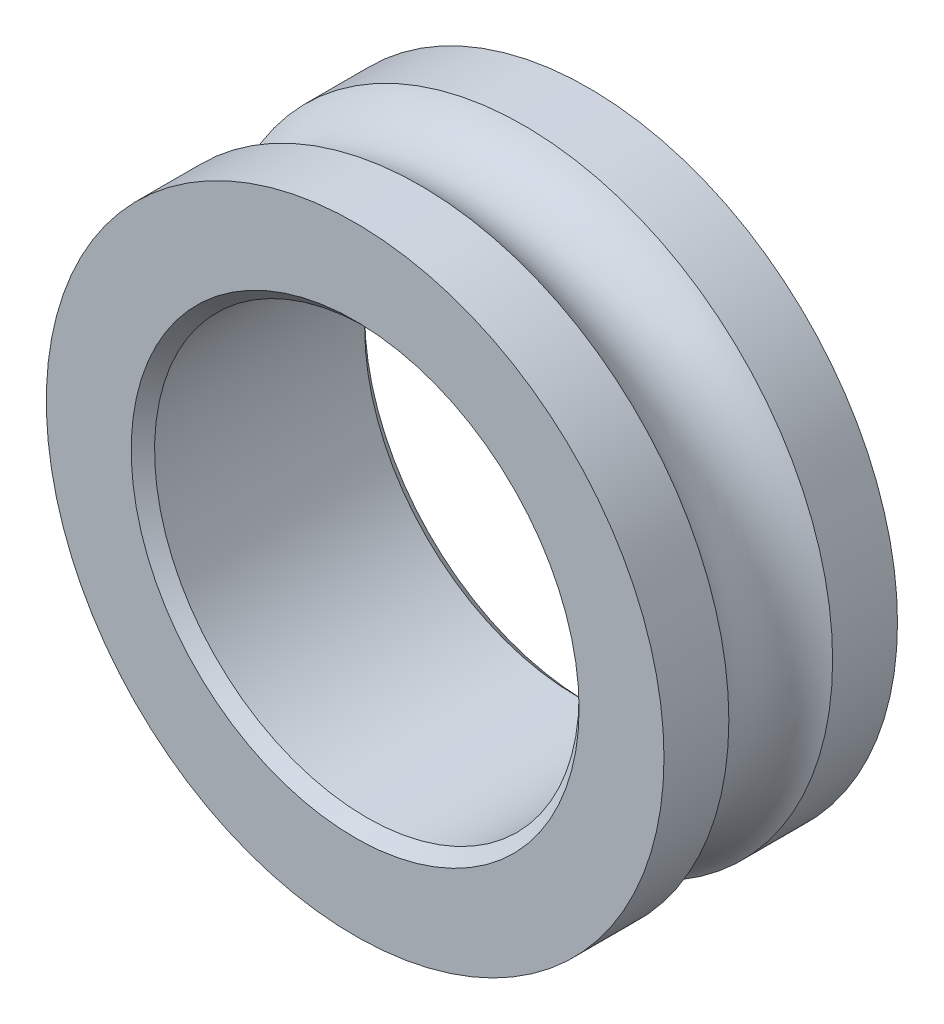
ISO-10303-21;
HEADER;
FILE_DESCRIPTION(('STEP AP214'),'2;1');
FILE_NAME('part.step','',(''),(''),'','','');
FILE_SCHEMA(('AUTOMOTIVE_DESIGN { 1 0 10303 214 1 1 1 1 }'));
ENDSEC;
DATA;
#1=APPLICATION_CONTEXT('core data for automotive mechanical design processes');
#2=APPLICATION_PROTOCOL_DEFINITION('international standard','automotive_design',2000,#1);
#3=PRODUCT_CONTEXT('',#1,'mechanical');
#4=PRODUCT('Part','Part','',(#3));
#5=PRODUCT_RELATED_PRODUCT_CATEGORY('part','',(#4));
#6=PRODUCT_DEFINITION_FORMATION('','',#4);
#7=PRODUCT_DEFINITION_CONTEXT('part definition',#1,'design');
#8=PRODUCT_DEFINITION('design','',#6,#7);
#9=PRODUCT_DEFINITION_SHAPE('','',#8);
#10=(LENGTH_UNIT() NAMED_UNIT(*) SI_UNIT(.MILLI.,.METRE.));
#11=(NAMED_UNIT(*) PLANE_ANGLE_UNIT() SI_UNIT($,.RADIAN.));
#12=(NAMED_UNIT(*) SI_UNIT($,.STERADIAN.) SOLID_ANGLE_UNIT());
#13=UNCERTAINTY_MEASURE_WITH_UNIT(LENGTH_MEASURE(1.E-05),#10,'distance_accuracy_value','');
#14=(GEOMETRIC_REPRESENTATION_CONTEXT(3) GLOBAL_UNCERTAINTY_ASSIGNED_CONTEXT((#13)) GLOBAL_UNIT_ASSIGNED_CONTEXT((#10,
#11,#12)) REPRESENTATION_CONTEXT('',''));
#15=CARTESIAN_POINT('',(0.,0.,0.));
#16=DIRECTION('',(0.,0.,1.));
#17=DIRECTION('',(1.,0.,0.));
#18=AXIS2_PLACEMENT_3D('',#15,#16,#17);
#19=CARTESIAN_POINT('',(12.703489010989,-12.703489010989,4.365625));
#20=DIRECTION('',(0.,0.,-1.));
#21=DIRECTION('',(0.,-1.,0.));
#22=AXIS2_PLACEMENT_3D('',#19,#20,#21);
#23=PLANE('',#22);
#24=CARTESIAN_POINT('',(0.,0.,4.3656249847201));
#25=DIRECTION('',(0.,0.,1.));
#26=DIRECTION('',(1.,0.,0.));
#27=AXIS2_PLACEMENT_3D('',#24,#25,#26);
#28=CIRCLE('',#27,8.37406251527991);
#29=CARTESIAN_POINT('',(8.37406251527991,0.,4.3656249847201));
#30=VERTEX_POINT('',#29);
#31=EDGE_CURVE('E42',#30,#30,#28,.T.);
#32=ORIENTED_EDGE('',*,*,#31,.F.);
#33=EDGE_LOOP('',(#32));
#34=FACE_BOUND('',#33,.T.);
#35=CARTESIAN_POINT('',(0.,0.,4.365625));
#36=DIRECTION('',(0.,0.,-1.));
#37=DIRECTION('',(1.,0.,0.));
#38=AXIS2_PLACEMENT_3D('',#35,#36,#37);
#39=CIRCLE('',#38,11.5486263736264);
#40=CARTESIAN_POINT('',(11.5486263736264,0.,4.365625));
#41=VERTEX_POINT('',#40);
#42=EDGE_CURVE('E36',#41,#41,#39,.T.);
#43=ORIENTED_EDGE('',*,*,#42,.F.);
#44=EDGE_LOOP('',(#43));
#45=FACE_BOUND('',#44,.T.);
#46=ADVANCED_FACE('F15',(#34,#45),#23,.F.);
#47=CARTESIAN_POINT('',(-12.703489010989,-12.703489010989,-4.365625));
#48=DIRECTION('',(0.,0.,1.));
#49=DIRECTION('',(1.,0.,0.));
#50=AXIS2_PLACEMENT_3D('',#47,#48,#49);
#51=PLANE('',#50);
#52=CARTESIAN_POINT('',(0.,0.,-4.3656249847201));
#53=DIRECTION('',(0.,0.,1.));
#54=DIRECTION('',(-1.,0.,0.));
#55=AXIS2_PLACEMENT_3D('',#52,#53,#54);
#56=CIRCLE('',#55,8.37406251527991);
#57=CARTESIAN_POINT('',(-8.37406251527991,0.,-4.3656249847201));
#58=VERTEX_POINT('',#57);
#59=EDGE_CURVE('E22',#58,#58,#56,.T.);
#60=ORIENTED_EDGE('',*,*,#59,.T.);
#61=EDGE_LOOP('',(#60));
#62=FACE_BOUND('',#61,.T.);
#63=CARTESIAN_POINT('',(0.,0.,-4.365625));
#64=DIRECTION('',(0.,0.,1.));
#65=DIRECTION('',(1.,0.,0.));
#66=AXIS2_PLACEMENT_3D('',#63,#64,#65);
#67=CIRCLE('',#66,11.5486263736264);
#68=CARTESIAN_POINT('',(11.5486263736264,0.,-4.365625));
#69=VERTEX_POINT('',#68);
#70=EDGE_CURVE('E10',#69,#69,#67,.T.);
#71=ORIENTED_EDGE('',*,*,#70,.F.);
#72=EDGE_LOOP('',(#71));
#73=FACE_BOUND('',#72,.T.);
#74=ADVANCED_FACE('F68',(#62,#73),#51,.F.);
#75=CARTESIAN_POINT('',(0.,0.,-4.48689236111112));
#76=DIRECTION('',(0.,0.,1.));
#77=DIRECTION('',(1.,0.,0.));
#78=AXIS2_PLACEMENT_3D('',#75,#76,#77);
#79=CYLINDRICAL_SURFACE('',#78,11.5486263736264);
#80=CARTESIAN_POINT('',(0.,0.,-1.94027777777779));
#81=DIRECTION('',(0.,0.,-1.));
#82=DIRECTION('',(1.,0.,0.));
#83=AXIS2_PLACEMENT_3D('',#80,#81,#82);
#84=CIRCLE('',#83,11.5486263736264);
#85=CARTESIAN_POINT('',(11.5486263736264,0.,-1.94027777777779));
#86=VERTEX_POINT('',#85);
#87=EDGE_CURVE('E44',#86,#86,#84,.T.);
#88=ORIENTED_EDGE('',*,*,#87,.T.);
#89=EDGE_LOOP('',(#88));
#90=FACE_BOUND('',#89,.T.);
#91=ORIENTED_EDGE('',*,*,#70,.T.);
#92=EDGE_LOOP('',(#91));
#93=FACE_BOUND('',#92,.T.);
#94=ADVANCED_FACE('F81',(#90,#93),#79,.T.);
#95=CARTESIAN_POINT('',(0.,0.,-4.3656249847201));
#96=DIRECTION('',(0.,0.,-1.));
#97=DIRECTION('',(-1.,0.,0.));
#98=AXIS2_PLACEMENT_3D('',#95,#96,#97);
#99=CONICAL_SURFACE('',#98,8.37406251527991,0.7853981625);
#100=ORIENTED_EDGE('',*,*,#59,.F.);
#101=EDGE_LOOP('',(#100));
#102=FACE_BOUND('',#101,.T.);
#103=CARTESIAN_POINT('',(0.,0.,-3.9290625));
#104=DIRECTION('',(0.,0.,1.));
#105=DIRECTION('',(1.,0.,0.));
#106=AXIS2_PLACEMENT_3D('',#103,#104,#105);
#107=CIRCLE('',#106,7.9375);
#108=CARTESIAN_POINT('',(7.9375,0.,-3.9290625));
#109=VERTEX_POINT('',#108);
#110=EDGE_CURVE('E33',#109,#109,#107,.T.);
#111=ORIENTED_EDGE('',*,*,#110,.T.);
#112=EDGE_LOOP('',(#111));
#113=FACE_BOUND('',#112,.T.);
#114=ADVANCED_FACE('F88',(#102,#113),#99,.F.);
#115=CARTESIAN_POINT('',(0.,0.,-4.32196875));
#116=DIRECTION('',(0.,0.,1.));
#117=DIRECTION('',(1.,0.,0.));
#118=AXIS2_PLACEMENT_3D('',#115,#116,#117);
#119=CYLINDRICAL_SURFACE('',#118,7.9375);
#120=CARTESIAN_POINT('',(0.,0.,3.92906248432831));
#121=DIRECTION('',(0.,0.,1.));
#122=DIRECTION('',(0.,-1.,0.));
#123=AXIS2_PLACEMENT_3D('',#120,#121,#122);
#124=CIRCLE('',#123,7.9375000156717);
#125=CARTESIAN_POINT('',(0.,-7.9375000156717,3.92906248432831));
#126=VERTEX_POINT('',#125);
#127=EDGE_CURVE('E47',#126,#126,#124,.T.);
#128=ORIENTED_EDGE('',*,*,#127,.T.);
#129=EDGE_LOOP('',(#128));
#130=FACE_BOUND('',#129,.T.);
#131=ORIENTED_EDGE('',*,*,#110,.F.);
#132=EDGE_LOOP('',(#131));
#133=FACE_BOUND('',#132,.T.);
#134=ADVANCED_FACE('F72',(#130,#133),#119,.F.);
#135=CARTESIAN_POINT('',(0.,0.,1.81901041666666));
#136=DIRECTION('',(0.,0.,1.));
#137=DIRECTION('',(1.,0.,0.));
#138=AXIS2_PLACEMENT_3D('',#135,#136,#137);
#139=CYLINDRICAL_SURFACE('',#138,11.5486263736264);
#140=ORIENTED_EDGE('',*,*,#42,.T.);
#141=EDGE_LOOP('',(#140));
#142=FACE_BOUND('',#141,.T.);
#143=CARTESIAN_POINT('',(0.,0.,1.94027777777778));
#144=DIRECTION('',(0.,0.,1.));
#145=DIRECTION('',(1.,0.,0.));
#146=AXIS2_PLACEMENT_3D('',#143,#144,#145);
#147=CIRCLE('',#146,11.5486263736264);
#148=CARTESIAN_POINT('',(11.5486263736264,0.,1.94027777777778));
#149=VERTEX_POINT('',#148);
#150=EDGE_CURVE('E49',#149,#149,#147,.T.);
#151=ORIENTED_EDGE('',*,*,#150,.T.);
#152=EDGE_LOOP('',(#151));
#153=FACE_BOUND('',#152,.T.);
#154=ADVANCED_FACE('F75',(#142,#153),#139,.T.);
#155=CARTESIAN_POINT('',(0.,0.,4.3656249847201));
#156=DIRECTION('',(0.,0.,1.));
#157=DIRECTION('',(1.,0.,0.));
#158=AXIS2_PLACEMENT_3D('',#155,#156,#157);
#159=CONICAL_SURFACE('',#158,8.37406251527991,0.7853981625);
#160=ORIENTED_EDGE('',*,*,#31,.T.);
#161=EDGE_LOOP('',(#160));
#162=FACE_BOUND('',#161,.T.);
#163=ORIENTED_EDGE('',*,*,#127,.F.);
#164=EDGE_LOOP('',(#163));
#165=FACE_BOUND('',#164,.T.);
#166=ADVANCED_FACE('F64',(#162,#165),#159,.F.);
#167=CARTESIAN_POINT('',(0.,0.,0.));
#168=DIRECTION('',(0.,0.,1.));
#169=DIRECTION('',(0.,-1.,0.));
#170=AXIS2_PLACEMENT_3D('',#167,#168,#169);
#171=TOROIDAL_SURFACE('',#170,12.7,2.25617798111032);
#172=ORIENTED_EDGE('',*,*,#150,.F.);
#173=EDGE_LOOP('',(#172));
#174=FACE_BOUND('',#173,.T.);
#175=ORIENTED_EDGE('',*,*,#87,.F.);
#176=EDGE_LOOP('',(#175));
#177=FACE_BOUND('',#176,.T.);
#178=ADVANCED_FACE('F77',(#174,#177),#171,.F.);
#179=CLOSED_SHELL('',(#46,#74,#94,#114,#134,#154,#166,#178));
#180=MANIFOLD_SOLID_BREP('B1',#179);
#181=ADVANCED_BREP_SHAPE_REPRESENTATION('',(#18,#180),#14);
#182=SHAPE_DEFINITION_REPRESENTATION(#9,#181);
ENDSEC;
END-ISO-10303-21;
